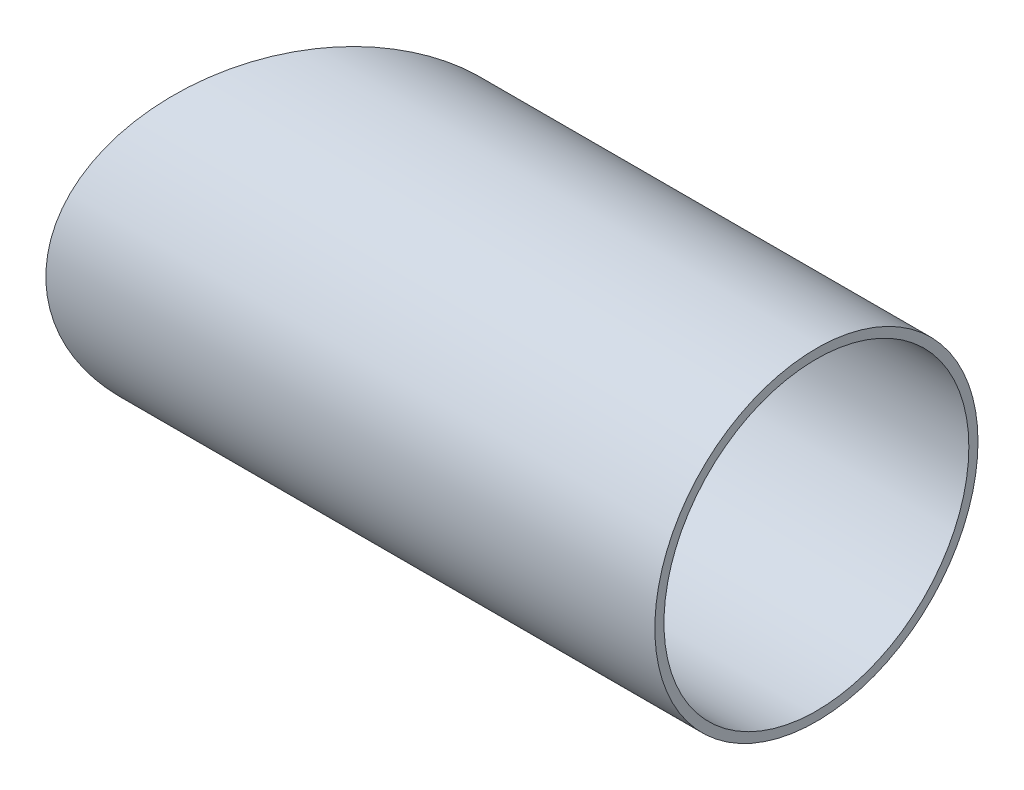
ISO-10303-21;
HEADER;
FILE_DESCRIPTION(('STEP AP214'),'2;1');
FILE_NAME('part.step','',(''),(''),'','','');
FILE_SCHEMA(('AUTOMOTIVE_DESIGN { 1 0 10303 214 1 1 1 1 }'));
ENDSEC;
DATA;
#1=APPLICATION_CONTEXT('core data for automotive mechanical design processes');
#2=APPLICATION_PROTOCOL_DEFINITION('international standard','automotive_design',2000,#1);
#3=PRODUCT_CONTEXT('',#1,'mechanical');
#4=PRODUCT('Part','Part','',(#3));
#5=PRODUCT_RELATED_PRODUCT_CATEGORY('part','',(#4));
#6=PRODUCT_DEFINITION_FORMATION('','',#4);
#7=PRODUCT_DEFINITION_CONTEXT('part definition',#1,'design');
#8=PRODUCT_DEFINITION('design','',#6,#7);
#9=PRODUCT_DEFINITION_SHAPE('','',#8);
#10=(LENGTH_UNIT() NAMED_UNIT(*) SI_UNIT(.MILLI.,.METRE.));
#11=(NAMED_UNIT(*) PLANE_ANGLE_UNIT() SI_UNIT($,.RADIAN.));
#12=(NAMED_UNIT(*) SI_UNIT($,.STERADIAN.) SOLID_ANGLE_UNIT());
#13=UNCERTAINTY_MEASURE_WITH_UNIT(LENGTH_MEASURE(1.E-05),#10,'distance_accuracy_value','');
#14=(GEOMETRIC_REPRESENTATION_CONTEXT(3) GLOBAL_UNCERTAINTY_ASSIGNED_CONTEXT((#13)) GLOBAL_UNIT_ASSIGNED_CONTEXT((#10,
#11,#12)) REPRESENTATION_CONTEXT('',''));
#15=CARTESIAN_POINT('',(0.,0.,0.));
#16=DIRECTION('',(0.,0.,1.));
#17=DIRECTION('',(1.,0.,0.));
#18=AXIS2_PLACEMENT_3D('',#15,#16,#17);
#19=CARTESIAN_POINT('',(-235.,-53.01,407.031939778686));
#20=DIRECTION('',(-0.866025403784439,0.,-0.5));
#21=DIRECTION('',(-0.5,0.,0.866025403784439));
#22=AXIS2_PLACEMENT_3D('',#19,#20,#21);
#23=PLANE('',#22);
#24=CARTESIAN_POINT('',(-404.145188432738,0.,700.));
#25=DIRECTION('',(-0.866025403784439,0.,-0.5));
#26=DIRECTION('',(0.5,0.,-0.866025403784439));
#27=AXIS2_PLACEMENT_3D('',#24,#25,#26);
#28=ELLIPSE('',#27,57.7350269189626,50.);
#29=CARTESIAN_POINT('',(-375.277674973257,0.,650.));
#30=VERTEX_POINT('',#29);
#31=EDGE_CURVE('E40',#30,#30,#28,.F.);
#32=ORIENTED_EDGE('',*,*,#31,.T.);
#33=EDGE_LOOP('',(#32));
#34=FACE_BOUND('',#33,.T.);
#35=CARTESIAN_POINT('',(-404.145188432738,0.,700.));
#36=DIRECTION('',(-0.866025403784439,0.,-0.5));
#37=DIRECTION('',(0.5,0.,-0.866025403784439));
#38=AXIS2_PLACEMENT_3D('',#35,#36,#37);
#39=ELLIPSE('',#38,61.1991285341004,53.);
#40=CARTESIAN_POINT('',(-373.545624165688,0.,647.));
#41=VERTEX_POINT('',#40);
#42=EDGE_CURVE('E11',#41,#41,#39,.F.);
#43=ORIENTED_EDGE('',*,*,#42,.F.);
#44=EDGE_LOOP('',(#43));
#45=FACE_BOUND('',#44,.T.);
#46=ADVANCED_FACE('F36',(#34,#45),#23,.T.);
#47=CARTESIAN_POINT('',(-235.,-53.01,407.031939778686));
#48=DIRECTION('',(1.,0.,0.));
#49=DIRECTION('',(0.,0.,-1.));
#50=AXIS2_PLACEMENT_3D('',#47,#48,#49);
#51=PLANE('',#50);
#52=CARTESIAN_POINT('',(-235.,0.,700.));
#53=DIRECTION('',(1.,0.,0.));
#54=DIRECTION('',(0.,0.,-1.));
#55=AXIS2_PLACEMENT_3D('',#52,#53,#54);
#56=CIRCLE('',#55,50.);
#57=CARTESIAN_POINT('',(-235.,0.,650.));
#58=VERTEX_POINT('',#57);
#59=EDGE_CURVE('E49',#58,#58,#56,.F.);
#60=ORIENTED_EDGE('',*,*,#59,.T.);
#61=EDGE_LOOP('',(#60));
#62=FACE_BOUND('',#61,.T.);
#63=CARTESIAN_POINT('',(-235.,0.,700.));
#64=DIRECTION('',(1.,0.,0.));
#65=DIRECTION('',(0.,0.,-1.));
#66=AXIS2_PLACEMENT_3D('',#63,#64,#65);
#67=CIRCLE('',#66,53.);
#68=CARTESIAN_POINT('',(-235.,0.,647.));
#69=VERTEX_POINT('',#68);
#70=EDGE_CURVE('E44',#69,#69,#67,.F.);
#71=ORIENTED_EDGE('',*,*,#70,.F.);
#72=EDGE_LOOP('',(#71));
#73=FACE_BOUND('',#72,.T.);
#74=ADVANCED_FACE('F62',(#62,#73),#51,.T.);
#75=CARTESIAN_POINT('',(-703.958463655835,0.,700.));
#76=DIRECTION('',(1.,0.,0.));
#77=DIRECTION('',(0.,0.,-1.));
#78=AXIS2_PLACEMENT_3D('',#75,#76,#77);
#79=CYLINDRICAL_SURFACE('',#78,53.);
#80=ORIENTED_EDGE('',*,*,#42,.T.);
#81=EDGE_LOOP('',(#80));
#82=FACE_BOUND('',#81,.T.);
#83=ORIENTED_EDGE('',*,*,#70,.T.);
#84=EDGE_LOOP('',(#83));
#85=FACE_BOUND('',#84,.T.);
#86=ADVANCED_FACE('F61',(#82,#85),#79,.T.);
#87=CARTESIAN_POINT('',(-703.958463655835,0.,700.));
#88=DIRECTION('',(1.,0.,0.));
#89=DIRECTION('',(0.,0.,-1.));
#90=AXIS2_PLACEMENT_3D('',#87,#88,#89);
#91=CYLINDRICAL_SURFACE('',#90,50.);
#92=ORIENTED_EDGE('',*,*,#31,.F.);
#93=EDGE_LOOP('',(#92));
#94=FACE_BOUND('',#93,.T.);
#95=ORIENTED_EDGE('',*,*,#59,.F.);
#96=EDGE_LOOP('',(#95));
#97=FACE_BOUND('',#96,.T.);
#98=ADVANCED_FACE('F38',(#94,#97),#91,.F.);
#99=CLOSED_SHELL('',(#46,#74,#86,#98));
#100=MANIFOLD_SOLID_BREP('B2',#99);
#101=ADVANCED_BREP_SHAPE_REPRESENTATION('',(#18,#100),#14);
#102=SHAPE_DEFINITION_REPRESENTATION(#9,#101);
ENDSEC;
END-ISO-10303-21;
